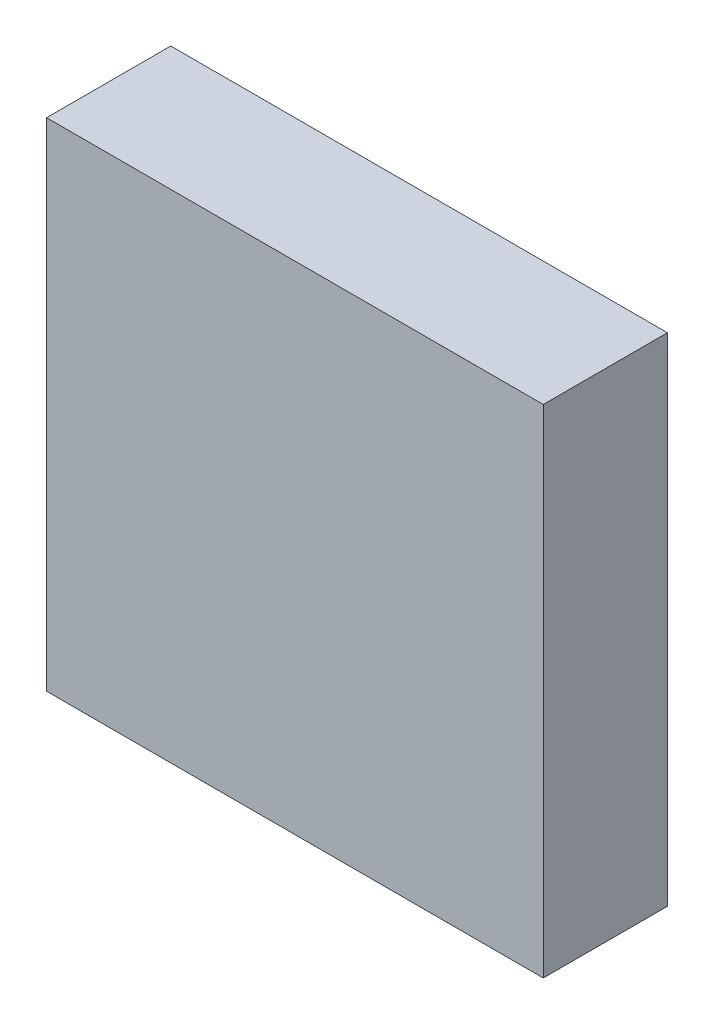
ISO-10303-21;
HEADER;
FILE_DESCRIPTION(('STEP AP214'),'2;1');
FILE_NAME('part.step','',(''),(''),'','','');
FILE_SCHEMA(('AUTOMOTIVE_DESIGN { 1 0 10303 214 1 1 1 1 }'));
ENDSEC;
DATA;
#1=APPLICATION_CONTEXT('core data for automotive mechanical design processes');
#2=APPLICATION_PROTOCOL_DEFINITION('international standard','automotive_design',2000,#1);
#3=PRODUCT_CONTEXT('',#1,'mechanical');
#4=PRODUCT('Part','Part','',(#3));
#5=PRODUCT_RELATED_PRODUCT_CATEGORY('part','',(#4));
#6=PRODUCT_DEFINITION_FORMATION('','',#4);
#7=PRODUCT_DEFINITION_CONTEXT('part definition',#1,'design');
#8=PRODUCT_DEFINITION('design','',#6,#7);
#9=PRODUCT_DEFINITION_SHAPE('','',#8);
#10=(LENGTH_UNIT() NAMED_UNIT(*) SI_UNIT(.MILLI.,.METRE.));
#11=(NAMED_UNIT(*) PLANE_ANGLE_UNIT() SI_UNIT($,.RADIAN.));
#12=(NAMED_UNIT(*) SI_UNIT($,.STERADIAN.) SOLID_ANGLE_UNIT());
#13=UNCERTAINTY_MEASURE_WITH_UNIT(LENGTH_MEASURE(1.E-05),#10,'distance_accuracy_value','');
#14=(GEOMETRIC_REPRESENTATION_CONTEXT(3) GLOBAL_UNCERTAINTY_ASSIGNED_CONTEXT((#13)) GLOBAL_UNIT_ASSIGNED_CONTEXT((#10,
#11,#12)) REPRESENTATION_CONTEXT('',''));
#15=CARTESIAN_POINT('',(0.,0.,0.));
#16=DIRECTION('',(0.,0.,1.));
#17=DIRECTION('',(1.,0.,0.));
#18=AXIS2_PLACEMENT_3D('',#15,#16,#17);
#19=CARTESIAN_POINT('',(-17.8771981494909,20.3309708492444,-0.69999887583625));
#20=DIRECTION('',(0.,8.74227339409094E-08,-1.));
#21=DIRECTION('',(-4.37113882867396E-08,-1.,-8.74227339409093E-08));
#22=AXIS2_PLACEMENT_3D('',#19,#20,#21);
#23=PLANE('',#22);
#24=CARTESIAN_POINT('',(-17.8771981494909,20.3309708492444,-0.69999887583625));
#25=DIRECTION('',(0.,8.74227339409094E-08,-1.));
#26=DIRECTION('',(-4.37113882867396E-08,-1.,-8.74227339409093E-08));
#27=AXIS2_PLACEMENT_3D('',#24,#25,#26);
#28=CIRCLE('',#27,0.1875);
#29=CARTESIAN_POINT('',(-17.8771981576868,20.1434708492444,-0.699998892228013));
#30=VERTEX_POINT('',#29);
#31=EDGE_CURVE('E11',#30,#30,#28,.T.);
#32=ORIENTED_EDGE('',*,*,#31,.T.);
#33=EDGE_LOOP('',(#32));
#34=FACE_BOUND('',#33,.T.);
#35=ADVANCED_FACE('F17',(#34),#23,.T.);
#36=CARTESIAN_POINT('',(-17.8771981494909,20.3309708492444,-0.69999887583625));
#37=DIRECTION('',(0.,8.74227339409094E-08,-1.));
#38=DIRECTION('',(-4.37113882867396E-08,-1.,-8.74227339409093E-08));
#39=AXIS2_PLACEMENT_3D('',#36,#37,#38);
#40=CYLINDRICAL_SURFACE('',#39,0.1875);
#41=CARTESIAN_POINT('',(-17.8771981494909,20.3309708579867,-0.79999887583625));
#42=DIRECTION('',(0.,8.74227339409094E-08,-1.));
#43=DIRECTION('',(-4.37113882867396E-08,-1.,-8.74227339409093E-08));
#44=AXIS2_PLACEMENT_3D('',#41,#42,#43);
#45=CIRCLE('',#44,0.1875);
#46=CARTESIAN_POINT('',(-17.8771981576868,20.1434708579867,-0.799998892228013));
#47=VERTEX_POINT('',#46);
#48=EDGE_CURVE('E111',#47,#47,#45,.T.);
#49=ORIENTED_EDGE('',*,*,#48,.T.);
#50=EDGE_LOOP('',(#49));
#51=FACE_BOUND('',#50,.T.);
#52=ORIENTED_EDGE('',*,*,#31,.F.);
#53=EDGE_LOOP('',(#52));
#54=FACE_BOUND('',#53,.T.);
#55=ADVANCED_FACE('F169',(#51,#54),#40,.F.);
#56=CARTESIAN_POINT('',(-15.3771982587694,17.8309706831412,-0.0499990943930964));
#57=DIRECTION('',(-4.37113882867396E-08,-1.,-8.74227339409093E-08));
#58=DIRECTION('',(0.,8.74227339409094E-08,-1.));
#59=AXIS2_PLACEMENT_3D('',#56,#57,#58);
#60=PLANE('',#59);
#61=DIRECTION('',(0.,8.74227339409094E-08,-1.));
#62=VECTOR('',#61,1.);
#63=CARTESIAN_POINT('',(-15.3771982587694,17.8309706831412,-0.0499990943930964));
#64=LINE('',#63,#62);
#65=CARTESIAN_POINT('',(-15.3771982587694,17.8309706831412,-0.0499990943930964));
#66=VERTEX_POINT('',#65);
#67=CARTESIAN_POINT('',(-15.3771982587694,17.8309707487082,-0.799999094393094));
#68=VERTEX_POINT('',#67);
#69=EDGE_CURVE('E76',#66,#68,#64,.T.);
#70=ORIENTED_EDGE('',*,*,#69,.F.);
#71=DIRECTION('',(-1.,4.37113882867395E-08,0.));
#72=VECTOR('',#71,1.);
#73=CARTESIAN_POINT('',(-15.3771982587694,17.8309706831412,-0.0499990943930964));
#74=LINE('',#73,#72);
#75=CARTESIAN_POINT('',(-18.3771982587694,17.8309708142754,-0.0499990943930852));
#76=VERTEX_POINT('',#75);
#77=EDGE_CURVE('E26',#66,#76,#74,.T.);
#78=ORIENTED_EDGE('',*,*,#77,.T.);
#79=DIRECTION('',(0.,8.74227339409094E-08,-1.));
#80=VECTOR('',#79,1.);
#81=CARTESIAN_POINT('',(-18.3771982587694,17.8309708142754,-0.0499990943930852));
#82=LINE('',#81,#80);
#83=CARTESIAN_POINT('',(-18.3771982587694,17.8309708798424,-0.799999094393083));
#84=VERTEX_POINT('',#83);
#85=EDGE_CURVE('E71',#76,#84,#82,.T.);
#86=ORIENTED_EDGE('',*,*,#85,.T.);
#87=DIRECTION('',(-1.,4.37113882867395E-08,0.));
#88=VECTOR('',#87,1.);
#89=CARTESIAN_POINT('',(-15.3771982587694,17.8309707487082,-0.799999094393094));
#90=LINE('',#89,#88);
#91=EDGE_CURVE('E81',#68,#84,#90,.T.);
#92=ORIENTED_EDGE('',*,*,#91,.F.);
#93=EDGE_LOOP('',(#70,#78,#86,#92));
#94=FACE_BOUND('',#93,.T.);
#95=ADVANCED_FACE('F84',(#94),#60,.T.);
#96=CARTESIAN_POINT('',(-15.3771981276352,20.8309706831412,-0.0499988321248945));
#97=DIRECTION('',(0.,8.74227339409094E-08,-1.));
#98=DIRECTION('',(-4.37113882867396E-08,-1.,-8.74227339409093E-08));
#99=AXIS2_PLACEMENT_3D('',#96,#97,#98);
#100=PLANE('',#99);
#101=DIRECTION('',(-4.37113882867396E-08,-1.,-8.74227339409093E-08));
#102=VECTOR('',#101,1.);
#103=CARTESIAN_POINT('',(-18.3771981276352,20.8309708142754,-0.0499988321248832));
#104=LINE('',#103,#102);
#105=CARTESIAN_POINT('',(-18.3771981276352,20.8309708142754,-0.0499988321248832));
#106=VERTEX_POINT('',#105);
#107=EDGE_CURVE('E69',#106,#76,#104,.T.);
#108=ORIENTED_EDGE('',*,*,#107,.T.);
#109=ORIENTED_EDGE('',*,*,#77,.F.);
#110=DIRECTION('',(-4.37113882867396E-08,-1.,-8.74227339409093E-08));
#111=VECTOR('',#110,1.);
#112=CARTESIAN_POINT('',(-15.3771981276352,20.8309706831412,-0.0499988321248945));
#113=LINE('',#112,#111);
#114=CARTESIAN_POINT('',(-15.3771981276352,20.8309706831412,-0.0499988321248945));
#115=VERTEX_POINT('',#114);
#116=EDGE_CURVE('E64',#115,#66,#113,.T.);
#117=ORIENTED_EDGE('',*,*,#116,.F.);
#118=DIRECTION('',(-1.,4.37113882867395E-08,0.));
#119=VECTOR('',#118,1.);
#120=CARTESIAN_POINT('',(-15.3771981276352,20.8309706831412,-0.0499988321248945));
#121=LINE('',#120,#119);
#122=EDGE_CURVE('E93',#115,#106,#121,.T.);
#123=ORIENTED_EDGE('',*,*,#122,.T.);
#124=EDGE_LOOP('',(#108,#109,#117,#123));
#125=FACE_BOUND('',#124,.T.);
#126=ADVANCED_FACE('F68',(#125),#100,.F.);
#127=CARTESIAN_POINT('',(-18.3771981276352,20.8309708142754,-0.0499988321248832));
#128=DIRECTION('',(-1.,4.37113882867395E-08,0.));
#129=DIRECTION('',(0.,8.74227339409094E-08,-1.));
#130=AXIS2_PLACEMENT_3D('',#127,#128,#129);
#131=PLANE('',#130);
#132=ORIENTED_EDGE('',*,*,#107,.F.);
#133=DIRECTION('',(0.,8.74227339409094E-08,-1.));
#134=VECTOR('',#133,1.);
#135=CARTESIAN_POINT('',(-18.3771981276352,20.8309708142754,-0.0499988321248832));
#136=LINE('',#135,#134);
#137=CARTESIAN_POINT('',(-18.3771981276352,20.8309708798424,-0.799998832124881));
#138=VERTEX_POINT('',#137);
#139=EDGE_CURVE('E135',#106,#138,#136,.T.);
#140=ORIENTED_EDGE('',*,*,#139,.T.);
#141=DIRECTION('',(-4.37113882867396E-08,-1.,-8.74227339409093E-08));
#142=VECTOR('',#141,1.);
#143=CARTESIAN_POINT('',(-18.3771981276352,20.8309708798424,-0.799998832124881));
#144=LINE('',#143,#142);
#145=EDGE_CURVE('E109',#138,#84,#144,.T.);
#146=ORIENTED_EDGE('',*,*,#145,.T.);
#147=ORIENTED_EDGE('',*,*,#85,.F.);
#148=EDGE_LOOP('',(#132,#140,#146,#147));
#149=FACE_BOUND('',#148,.T.);
#150=ADVANCED_FACE('F158',(#149),#131,.T.);
#151=CARTESIAN_POINT('',(-15.3771981276352,20.8309707487082,-0.799998832124893));
#152=DIRECTION('',(0.,8.74227339409094E-08,-1.));
#153=DIRECTION('',(-4.37113882867396E-08,-1.,-8.74227339409093E-08));
#154=AXIS2_PLACEMENT_3D('',#151,#152,#153);
#155=PLANE('',#154);
#156=ORIENTED_EDGE('',*,*,#48,.F.);
#157=EDGE_LOOP('',(#156));
#158=FACE_BOUND('',#157,.T.);
#159=DIRECTION('',(-1.,4.37113882867395E-08,0.));
#160=VECTOR('',#159,1.);
#161=CARTESIAN_POINT('',(-15.3771981276352,20.8309707487082,-0.799998832124893));
#162=LINE('',#161,#160);
#163=CARTESIAN_POINT('',(-15.3771981276352,20.8309707487082,-0.799998832124893));
#164=VERTEX_POINT('',#163);
#165=EDGE_CURVE('E139',#164,#138,#162,.T.);
#166=ORIENTED_EDGE('',*,*,#165,.F.);
#167=DIRECTION('',(-4.37113882867396E-08,-1.,-8.74227339409093E-08));
#168=VECTOR('',#167,1.);
#169=CARTESIAN_POINT('',(-15.3771981276352,20.8309707487082,-0.799998832124893));
#170=LINE('',#169,#168);
#171=EDGE_CURVE('E82',#164,#68,#170,.T.);
#172=ORIENTED_EDGE('',*,*,#171,.T.);
#173=ORIENTED_EDGE('',*,*,#91,.T.);
#174=ORIENTED_EDGE('',*,*,#145,.F.);
#175=EDGE_LOOP('',(#166,#172,#173,#174));
#176=FACE_BOUND('',#175,.T.);
#177=ADVANCED_FACE('F156',(#158,#176),#155,.T.);
#178=CARTESIAN_POINT('',(-15.3771981276352,20.8309706831412,-0.0499988321248945));
#179=DIRECTION('',(-1.,4.37113882867395E-08,0.));
#180=DIRECTION('',(0.,8.74227339409094E-08,-1.));
#181=AXIS2_PLACEMENT_3D('',#178,#179,#180);
#182=PLANE('',#181);
#183=ORIENTED_EDGE('',*,*,#69,.T.);
#184=ORIENTED_EDGE('',*,*,#171,.F.);
#185=DIRECTION('',(0.,8.74227339409094E-08,-1.));
#186=VECTOR('',#185,1.);
#187=CARTESIAN_POINT('',(-15.3771981276352,20.8309706831412,-0.0499988321248945));
#188=LINE('',#187,#186);
#189=EDGE_CURVE('E78',#115,#164,#188,.T.);
#190=ORIENTED_EDGE('',*,*,#189,.F.);
#191=ORIENTED_EDGE('',*,*,#116,.T.);
#192=EDGE_LOOP('',(#183,#184,#190,#191));
#193=FACE_BOUND('',#192,.T.);
#194=ADVANCED_FACE('F75',(#193),#182,.F.);
#195=CARTESIAN_POINT('',(-15.3771981276352,20.8309706831412,-0.0499988321248945));
#196=DIRECTION('',(-4.37113882867396E-08,-1.,-8.74227339409093E-08));
#197=DIRECTION('',(0.,8.74227339409094E-08,-1.));
#198=AXIS2_PLACEMENT_3D('',#195,#196,#197);
#199=PLANE('',#198);
#200=ORIENTED_EDGE('',*,*,#165,.T.);
#201=ORIENTED_EDGE('',*,*,#139,.F.);
#202=ORIENTED_EDGE('',*,*,#122,.F.);
#203=ORIENTED_EDGE('',*,*,#189,.T.);
#204=EDGE_LOOP('',(#200,#201,#202,#203));
#205=FACE_BOUND('',#204,.T.);
#206=ADVANCED_FACE('F154',(#205),#199,.F.);
#207=CLOSED_SHELL('',(#35,#55,#95,#126,#150,#177,#194,#206));
#208=MANIFOLD_SOLID_BREP('B1',#207);
#209=ADVANCED_BREP_SHAPE_REPRESENTATION('',(#18,#208),#14);
#210=SHAPE_DEFINITION_REPRESENTATION(#9,#209);
ENDSEC;
END-ISO-10303-21;
